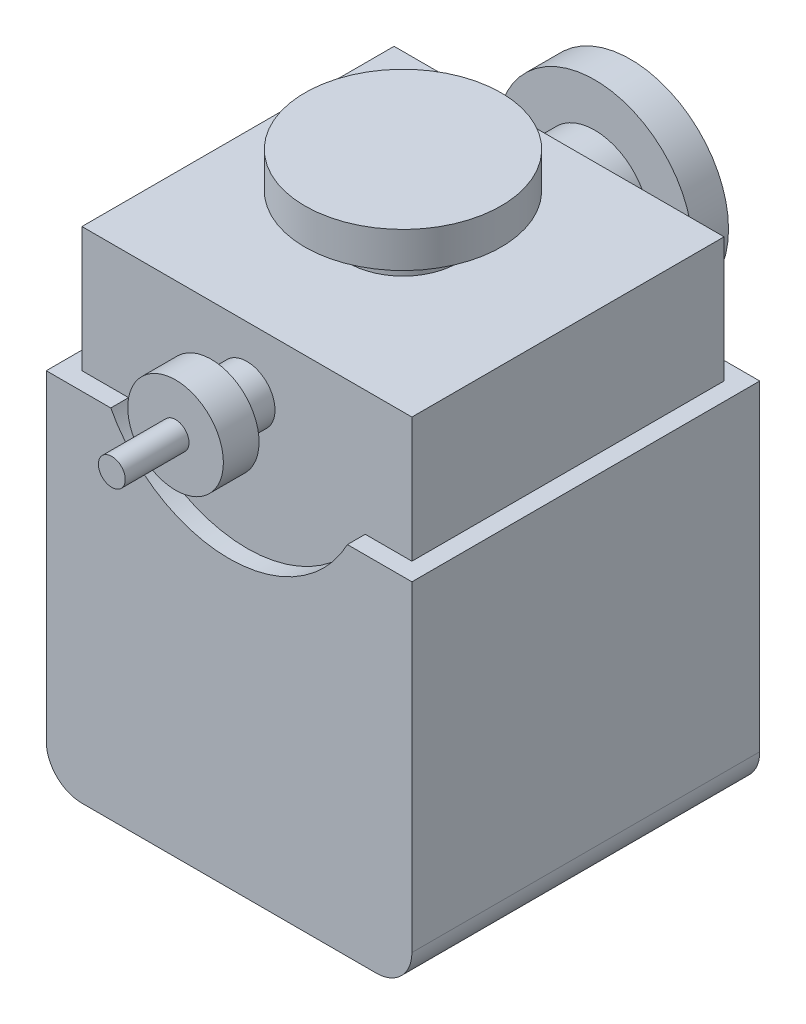
ISO-10303-21;
HEADER;
FILE_DESCRIPTION(('STEP AP214'),'2;1');
FILE_NAME('part.step','',(''),(''),'','','');
FILE_SCHEMA(('AUTOMOTIVE_DESIGN { 1 0 10303 214 1 1 1 1 }'));
ENDSEC;
DATA;
#1=APPLICATION_CONTEXT('core data for automotive mechanical design processes');
#2=APPLICATION_PROTOCOL_DEFINITION('international standard','automotive_design',2000,#1);
#3=PRODUCT_CONTEXT('',#1,'mechanical');
#4=PRODUCT('Part','Part','',(#3));
#5=PRODUCT_RELATED_PRODUCT_CATEGORY('part','',(#4));
#6=PRODUCT_DEFINITION_FORMATION('','',#4);
#7=PRODUCT_DEFINITION_CONTEXT('part definition',#1,'design');
#8=PRODUCT_DEFINITION('design','',#6,#7);
#9=PRODUCT_DEFINITION_SHAPE('','',#8);
#10=(LENGTH_UNIT() NAMED_UNIT(*) SI_UNIT(.MILLI.,.METRE.));
#11=(NAMED_UNIT(*) PLANE_ANGLE_UNIT() SI_UNIT($,.RADIAN.));
#12=(NAMED_UNIT(*) SI_UNIT($,.STERADIAN.) SOLID_ANGLE_UNIT());
#13=UNCERTAINTY_MEASURE_WITH_UNIT(LENGTH_MEASURE(1.E-05),#10,'distance_accuracy_value','');
#14=(GEOMETRIC_REPRESENTATION_CONTEXT(3) GLOBAL_UNCERTAINTY_ASSIGNED_CONTEXT((#13)) GLOBAL_UNIT_ASSIGNED_CONTEXT((#10,
#11,#12)) REPRESENTATION_CONTEXT('',''));
#15=CARTESIAN_POINT('',(0.,0.,0.));
#16=DIRECTION('',(0.,0.,1.));
#17=DIRECTION('',(1.,0.,0.));
#18=AXIS2_PLACEMENT_3D('',#15,#16,#17);
#19=CARTESIAN_POINT('',(0.,-57.14,0.));
#20=DIRECTION('',(0.,-1.,0.));
#21=DIRECTION('',(0.,0.,-1.));
#22=AXIS2_PLACEMENT_3D('',#19,#20,#21);
#23=PLANE('',#22);
#24=DIRECTION('',(0.,0.,-1.));
#25=VECTOR('',#24,1.);
#26=CARTESIAN_POINT('',(-42.1211348375136,-57.14,61.9125));
#27=LINE('',#26,#25);
#28=CARTESIAN_POINT('',(-42.1211348375136,-57.14,55.5625));
#29=VERTEX_POINT('',#28);
#30=CARTESIAN_POINT('',(-42.1211348375136,-57.14,61.9125));
#31=VERTEX_POINT('',#30);
#32=EDGE_CURVE('E62',#29,#31,#27,.F.);
#33=ORIENTED_EDGE('',*,*,#32,.F.);
#34=DIRECTION('',(-1.,0.,0.));
#35=VECTOR('',#34,1.);
#36=CARTESIAN_POINT('',(-58.7375,-57.14,55.5625));
#37=LINE('',#36,#35);
#38=CARTESIAN_POINT('',(-58.7375,-57.14,55.5625));
#39=VERTEX_POINT('',#38);
#40=EDGE_CURVE('E206',#29,#39,#37,.T.);
#41=ORIENTED_EDGE('',*,*,#40,.T.);
#42=DIRECTION('',(0.,0.,-1.));
#43=VECTOR('',#42,1.);
#44=CARTESIAN_POINT('',(-58.7375,-57.14,-55.5625));
#45=LINE('',#44,#43);
#46=CARTESIAN_POINT('',(-58.7375,-57.14,-55.5625));
#47=VERTEX_POINT('',#46);
#48=EDGE_CURVE('E210',#39,#47,#45,.T.);
#49=ORIENTED_EDGE('',*,*,#48,.T.);
#50=DIRECTION('',(1.,0.,0.));
#51=VECTOR('',#50,1.);
#52=CARTESIAN_POINT('',(-58.7375,-57.14,-55.5625));
#53=LINE('',#52,#51);
#54=CARTESIAN_POINT('',(-42.1211348375136,-57.14,-55.5625));
#55=VERTEX_POINT('',#54);
#56=EDGE_CURVE('E215',#47,#55,#53,.T.);
#57=ORIENTED_EDGE('',*,*,#56,.T.);
#58=DIRECTION('',(0.,0.,1.));
#59=VECTOR('',#58,1.);
#60=CARTESIAN_POINT('',(-42.1211348375136,-57.14,-61.9125));
#61=LINE('',#60,#59);
#62=CARTESIAN_POINT('',(-42.1211348375136,-57.14,-61.9125));
#63=VERTEX_POINT('',#62);
#64=EDGE_CURVE('E326',#63,#55,#61,.T.);
#65=ORIENTED_EDGE('',*,*,#64,.F.);
#66=DIRECTION('',(1.,0.,0.));
#67=VECTOR('',#66,1.);
#68=CARTESIAN_POINT('',(-65.0875,-57.14,-61.9125));
#69=LINE('',#68,#67);
#70=CARTESIAN_POINT('',(-65.0875,-57.14,-61.9125));
#71=VERTEX_POINT('',#70);
#72=EDGE_CURVE('E183',#71,#63,#69,.T.);
#73=ORIENTED_EDGE('',*,*,#72,.F.);
#74=DIRECTION('',(0.,0.,-1.));
#75=VECTOR('',#74,1.);
#76=CARTESIAN_POINT('',(-65.0875,-57.14,61.9125));
#77=LINE('',#76,#75);
#78=CARTESIAN_POINT('',(-65.0875,-57.14,61.9125));
#79=VERTEX_POINT('',#78);
#80=EDGE_CURVE('E171',#79,#71,#77,.T.);
#81=ORIENTED_EDGE('',*,*,#80,.F.);
#82=DIRECTION('',(-1.,0.,0.));
#83=VECTOR('',#82,1.);
#84=CARTESIAN_POINT('',(-65.0875,-57.14,61.9125));
#85=LINE('',#84,#83);
#86=EDGE_CURVE('E172',#31,#79,#85,.T.);
#87=ORIENTED_EDGE('',*,*,#86,.F.);
#88=EDGE_LOOP('',(#33,#41,#49,#57,#65,#73,#81,#87));
#89=FACE_BOUND('',#88,.T.);
#90=ADVANCED_FACE('F45',(#89),#23,.F.);
#91=DIRECTION('',(0.,0.,-1.));
#92=VECTOR('',#91,1.);
#93=CARTESIAN_POINT('',(42.1211348375136,-57.14,61.9125));
#94=LINE('',#93,#92);
#95=CARTESIAN_POINT('',(42.1211348375136,-57.14,61.9125));
#96=VERTEX_POINT('',#95);
#97=CARTESIAN_POINT('',(42.1211348375136,-57.14,55.5625));
#98=VERTEX_POINT('',#97);
#99=EDGE_CURVE('E148',#96,#98,#94,.T.);
#100=ORIENTED_EDGE('',*,*,#99,.F.);
#101=CARTESIAN_POINT('',(65.0875,-57.14,61.9125));
#102=VERTEX_POINT('',#101);
#103=EDGE_CURVE('E161',#102,#96,#85,.T.);
#104=ORIENTED_EDGE('',*,*,#103,.F.);
#105=DIRECTION('',(0.,0.,1.));
#106=VECTOR('',#105,1.);
#107=CARTESIAN_POINT('',(65.0875,-57.14,61.9125));
#108=LINE('',#107,#106);
#109=CARTESIAN_POINT('',(65.0875,-57.14,-61.9125));
#110=VERTEX_POINT('',#109);
#111=EDGE_CURVE('E179',#110,#102,#108,.T.);
#112=ORIENTED_EDGE('',*,*,#111,.F.);
#113=CARTESIAN_POINT('',(42.1211348375136,-57.14,-61.9125));
#114=VERTEX_POINT('',#113);
#115=EDGE_CURVE('E177',#114,#110,#69,.T.);
#116=ORIENTED_EDGE('',*,*,#115,.F.);
#117=DIRECTION('',(0.,0.,1.));
#118=VECTOR('',#117,1.);
#119=CARTESIAN_POINT('',(42.1211348375136,-57.14,-61.9125));
#120=LINE('',#119,#118);
#121=CARTESIAN_POINT('',(42.1211348375136,-57.14,-55.5625));
#122=VERTEX_POINT('',#121);
#123=EDGE_CURVE('E70',#122,#114,#120,.F.);
#124=ORIENTED_EDGE('',*,*,#123,.F.);
#125=CARTESIAN_POINT('',(58.7375,-57.14,-55.5625));
#126=VERTEX_POINT('',#125);
#127=EDGE_CURVE('E214',#122,#126,#53,.T.);
#128=ORIENTED_EDGE('',*,*,#127,.T.);
#129=DIRECTION('',(0.,0.,1.));
#130=VECTOR('',#129,1.);
#131=CARTESIAN_POINT('',(58.7375,-57.14,-55.5625));
#132=LINE('',#131,#130);
#133=CARTESIAN_POINT('',(58.7375,-57.14,55.5625));
#134=VERTEX_POINT('',#133);
#135=EDGE_CURVE('E203',#126,#134,#132,.T.);
#136=ORIENTED_EDGE('',*,*,#135,.T.);
#137=EDGE_CURVE('E164',#134,#98,#37,.T.);
#138=ORIENTED_EDGE('',*,*,#137,.T.);
#139=EDGE_LOOP('',(#100,#104,#112,#116,#124,#128,#136,#138));
#140=FACE_BOUND('',#139,.T.);
#141=ADVANCED_FACE('F159',(#140),#23,.F.);
#142=CARTESIAN_POINT('',(0.,12.69,0.));
#143=DIRECTION('',(0.,-1.,0.));
#144=DIRECTION('',(0.,0.,-1.));
#145=AXIS2_PLACEMENT_3D('',#142,#143,#144);
#146=CYLINDRICAL_SURFACE('',#145,34.9250000000001);
#147=CARTESIAN_POINT('',(0.,12.69,0.));
#148=DIRECTION('',(0.,1.,0.));
#149=DIRECTION('',(0.,0.,1.));
#150=AXIS2_PLACEMENT_3D('',#147,#148,#149);
#151=CIRCLE('',#150,34.9250000000001);
#152=CARTESIAN_POINT('',(0.,12.69,34.9250000000001));
#153=VERTEX_POINT('',#152);
#154=EDGE_CURVE('E256',#153,#153,#151,.T.);
#155=ORIENTED_EDGE('',*,*,#154,.F.);
#156=EDGE_LOOP('',(#155));
#157=FACE_BOUND('',#156,.T.);
#158=CARTESIAN_POINT('',(0.,0.,0.));
#159=DIRECTION('',(0.,1.,0.));
#160=DIRECTION('',(0.,0.,1.));
#161=AXIS2_PLACEMENT_3D('',#158,#159,#160);
#162=CIRCLE('',#161,34.9250000000001);
#163=CARTESIAN_POINT('',(0.,0.,34.9250000000001));
#164=VERTEX_POINT('',#163);
#165=EDGE_CURVE('E250',#164,#164,#162,.T.);
#166=ORIENTED_EDGE('',*,*,#165,.T.);
#167=EDGE_LOOP('',(#166));
#168=FACE_BOUND('',#167,.T.);
#169=ADVANCED_FACE('F402',(#157,#168),#146,.T.);
#170=CARTESIAN_POINT('',(0.,12.69,0.));
#171=DIRECTION('',(0.,1.,0.));
#172=DIRECTION('',(0.,0.,1.));
#173=AXIS2_PLACEMENT_3D('',#170,#171,#172);
#174=PLANE('',#173);
#175=ORIENTED_EDGE('',*,*,#154,.T.);
#176=EDGE_LOOP('',(#175));
#177=FACE_BOUND('',#176,.T.);
#178=ADVANCED_FACE('F436',(#177),#174,.T.);
#179=CARTESIAN_POINT('',(0.,0.,0.));
#180=DIRECTION('',(0.,1.,0.));
#181=DIRECTION('',(0.,0.,1.));
#182=AXIS2_PLACEMENT_3D('',#179,#180,#181);
#183=PLANE('',#182);
#184=CARTESIAN_POINT('',(0.,0.,0.));
#185=DIRECTION('',(0.,-1.,0.));
#186=DIRECTION('',(0.,0.,-1.));
#187=AXIS2_PLACEMENT_3D('',#184,#185,#186);
#188=CIRCLE('',#187,19.4);
#189=CARTESIAN_POINT('',(0.,0.,-19.4));
#190=VERTEX_POINT('',#189);
#191=EDGE_CURVE('E251',#190,#190,#188,.T.);
#192=ORIENTED_EDGE('',*,*,#191,.F.);
#193=EDGE_LOOP('',(#192));
#194=FACE_BOUND('',#193,.T.);
#195=ORIENTED_EDGE('',*,*,#165,.F.);
#196=EDGE_LOOP('',(#195));
#197=FACE_BOUND('',#196,.T.);
#198=ADVANCED_FACE('F434',(#194,#197),#183,.F.);
#199=CARTESIAN_POINT('',(0.,-12.69,0.));
#200=DIRECTION('',(0.,1.,0.));
#201=DIRECTION('',(0.,0.,1.));
#202=AXIS2_PLACEMENT_3D('',#199,#200,#201);
#203=CYLINDRICAL_SURFACE('',#202,19.4);
#204=CARTESIAN_POINT('',(0.,-12.69,0.));
#205=DIRECTION('',(0.,-1.,0.));
#206=DIRECTION('',(0.,0.,-1.));
#207=AXIS2_PLACEMENT_3D('',#204,#205,#206);
#208=CIRCLE('',#207,19.4);
#209=CARTESIAN_POINT('',(0.,-12.69,-19.4));
#210=VERTEX_POINT('',#209);
#211=EDGE_CURVE('E246',#210,#210,#208,.T.);
#212=ORIENTED_EDGE('',*,*,#211,.F.);
#213=EDGE_LOOP('',(#212));
#214=FACE_BOUND('',#213,.T.);
#215=ORIENTED_EDGE('',*,*,#191,.T.);
#216=EDGE_LOOP('',(#215));
#217=FACE_BOUND('',#216,.T.);
#218=ADVANCED_FACE('F430',(#214,#217),#203,.T.);
#219=CARTESIAN_POINT('',(58.7375,-57.14,-55.5625));
#220=DIRECTION('',(-1.,0.,0.));
#221=DIRECTION('',(0.,0.,1.));
#222=AXIS2_PLACEMENT_3D('',#219,#220,#221);
#223=PLANE('',#222);
#224=DIRECTION('',(0.,0.,1.));
#225=VECTOR('',#224,1.);
#226=CARTESIAN_POINT('',(58.7375,-12.69,-55.5625));
#227=LINE('',#226,#225);
#228=CARTESIAN_POINT('',(58.7375,-12.69,-55.5625));
#229=VERTEX_POINT('',#228);
#230=CARTESIAN_POINT('',(58.7375,-12.69,55.5625));
#231=VERTEX_POINT('',#230);
#232=EDGE_CURVE('E202',#229,#231,#227,.T.);
#233=ORIENTED_EDGE('',*,*,#232,.T.);
#234=DIRECTION('',(0.,1.,0.));
#235=VECTOR('',#234,1.);
#236=CARTESIAN_POINT('',(58.7375,-57.14,55.5625));
#237=LINE('',#236,#235);
#238=EDGE_CURVE('E242',#134,#231,#237,.T.);
#239=ORIENTED_EDGE('',*,*,#238,.F.);
#240=ORIENTED_EDGE('',*,*,#135,.F.);
#241=DIRECTION('',(0.,1.,0.));
#242=VECTOR('',#241,1.);
#243=CARTESIAN_POINT('',(58.7375,-57.14,-55.5625));
#244=LINE('',#243,#242);
#245=EDGE_CURVE('E219',#126,#229,#244,.T.);
#246=ORIENTED_EDGE('',*,*,#245,.T.);
#247=EDGE_LOOP('',(#233,#239,#240,#246));
#248=FACE_BOUND('',#247,.T.);
#249=ADVANCED_FACE('F303',(#248),#223,.F.);
#250=CARTESIAN_POINT('',(-58.7375,-57.14,55.5625));
#251=DIRECTION('',(0.,0.,-1.));
#252=DIRECTION('',(-1.,0.,0.));
#253=AXIS2_PLACEMENT_3D('',#250,#251,#252);
#254=PLANE('',#253);
#255=CARTESIAN_POINT('',(0.,-34.915,55.5625));
#256=DIRECTION('',(0.,0.,-1.));
#257=DIRECTION('',(-1.,0.,0.));
#258=AXIS2_PLACEMENT_3D('',#255,#256,#257);
#259=CIRCLE('',#258,10.);
#260=CARTESIAN_POINT('',(-10.,-34.915,55.5625));
#261=VERTEX_POINT('',#260);
#262=EDGE_CURVE('E49',#261,#261,#259,.F.);
#263=ORIENTED_EDGE('',*,*,#262,.F.);
#264=EDGE_LOOP('',(#263));
#265=FACE_BOUND('',#264,.T.);
#266=ORIENTED_EDGE('',*,*,#40,.F.);
#267=CARTESIAN_POINT('',(0.,-34.915,55.5625));
#268=DIRECTION('',(0.,0.,1.));
#269=DIRECTION('',(1.,0.,0.));
#270=AXIS2_PLACEMENT_3D('',#267,#268,#269);
#271=CIRCLE('',#270,47.625);
#272=EDGE_CURVE('E154',#29,#98,#271,.T.);
#273=ORIENTED_EDGE('',*,*,#272,.T.);
#274=ORIENTED_EDGE('',*,*,#137,.F.);
#275=ORIENTED_EDGE('',*,*,#238,.T.);
#276=DIRECTION('',(-1.,0.,0.));
#277=VECTOR('',#276,1.);
#278=CARTESIAN_POINT('',(-58.7375,-12.69,55.5625));
#279=LINE('',#278,#277);
#280=CARTESIAN_POINT('',(-58.7375,-12.69,55.5625));
#281=VERTEX_POINT('',#280);
#282=EDGE_CURVE('E223',#231,#281,#279,.T.);
#283=ORIENTED_EDGE('',*,*,#282,.T.);
#284=DIRECTION('',(0.,1.,0.));
#285=VECTOR('',#284,1.);
#286=CARTESIAN_POINT('',(-58.7375,-57.14,55.5625));
#287=LINE('',#286,#285);
#288=EDGE_CURVE('E238',#39,#281,#287,.T.);
#289=ORIENTED_EDGE('',*,*,#288,.F.);
#290=EDGE_LOOP('',(#266,#273,#274,#275,#283,#289));
#291=FACE_BOUND('',#290,.T.);
#292=ADVANCED_FACE('F299',(#265,#291),#254,.F.);
#293=CARTESIAN_POINT('',(-58.7375,-57.14,-55.5625));
#294=DIRECTION('',(1.,0.,0.));
#295=DIRECTION('',(0.,0.,-1.));
#296=AXIS2_PLACEMENT_3D('',#293,#294,#295);
#297=PLANE('',#296);
#298=DIRECTION('',(0.,0.,-1.));
#299=VECTOR('',#298,1.);
#300=CARTESIAN_POINT('',(-58.7375,-12.69,-55.5625));
#301=LINE('',#300,#299);
#302=CARTESIAN_POINT('',(-58.7375,-12.69,-55.5625));
#303=VERTEX_POINT('',#302);
#304=EDGE_CURVE('E226',#281,#303,#301,.T.);
#305=ORIENTED_EDGE('',*,*,#304,.T.);
#306=DIRECTION('',(0.,1.,0.));
#307=VECTOR('',#306,1.);
#308=CARTESIAN_POINT('',(-58.7375,-57.14,-55.5625));
#309=LINE('',#308,#307);
#310=EDGE_CURVE('E234',#47,#303,#309,.T.);
#311=ORIENTED_EDGE('',*,*,#310,.F.);
#312=ORIENTED_EDGE('',*,*,#48,.F.);
#313=ORIENTED_EDGE('',*,*,#288,.T.);
#314=EDGE_LOOP('',(#305,#311,#312,#313));
#315=FACE_BOUND('',#314,.T.);
#316=ADVANCED_FACE('F302',(#315),#297,.F.);
#317=CARTESIAN_POINT('',(-58.7375,-57.14,-55.5625));
#318=DIRECTION('',(0.,0.,1.));
#319=DIRECTION('',(1.,0.,0.));
#320=AXIS2_PLACEMENT_3D('',#317,#318,#319);
#321=PLANE('',#320);
#322=CARTESIAN_POINT('',(0.,-34.915,-55.5625));
#323=DIRECTION('',(0.,0.,1.));
#324=DIRECTION('',(1.,0.,0.));
#325=AXIS2_PLACEMENT_3D('',#322,#323,#324);
#326=CIRCLE('',#325,19.4);
#327=CARTESIAN_POINT('',(19.4,-34.915,-55.5625));
#328=VERTEX_POINT('',#327);
#329=EDGE_CURVE('E288',#328,#328,#326,.F.);
#330=ORIENTED_EDGE('',*,*,#329,.F.);
#331=EDGE_LOOP('',(#330));
#332=FACE_BOUND('',#331,.T.);
#333=ORIENTED_EDGE('',*,*,#127,.F.);
#334=CARTESIAN_POINT('',(0.,-34.915,-55.5625));
#335=DIRECTION('',(0.,0.,-1.));
#336=DIRECTION('',(-1.,0.,0.));
#337=AXIS2_PLACEMENT_3D('',#334,#335,#336);
#338=CIRCLE('',#337,47.625);
#339=EDGE_CURVE('E331',#122,#55,#338,.T.);
#340=ORIENTED_EDGE('',*,*,#339,.T.);
#341=ORIENTED_EDGE('',*,*,#56,.F.);
#342=ORIENTED_EDGE('',*,*,#310,.T.);
#343=DIRECTION('',(1.,0.,0.));
#344=VECTOR('',#343,1.);
#345=CARTESIAN_POINT('',(-58.7375,-12.69,-55.5625));
#346=LINE('',#345,#344);
#347=EDGE_CURVE('E207',#303,#229,#346,.T.);
#348=ORIENTED_EDGE('',*,*,#347,.T.);
#349=ORIENTED_EDGE('',*,*,#245,.F.);
#350=EDGE_LOOP('',(#333,#340,#341,#342,#348,#349));
#351=FACE_BOUND('',#350,.T.);
#352=ADVANCED_FACE('F420',(#332,#351),#321,.F.);
#353=CARTESIAN_POINT('',(0.,-12.69,0.));
#354=DIRECTION('',(0.,1.,0.));
#355=DIRECTION('',(0.,0.,1.));
#356=AXIS2_PLACEMENT_3D('',#353,#354,#355);
#357=PLANE('',#356);
#358=ORIENTED_EDGE('',*,*,#211,.T.);
#359=EDGE_LOOP('',(#358));
#360=FACE_BOUND('',#359,.T.);
#361=ORIENTED_EDGE('',*,*,#232,.F.);
#362=ORIENTED_EDGE('',*,*,#347,.F.);
#363=ORIENTED_EDGE('',*,*,#304,.F.);
#364=ORIENTED_EDGE('',*,*,#282,.F.);
#365=EDGE_LOOP('',(#361,#362,#363,#364));
#366=FACE_BOUND('',#365,.T.);
#367=ADVANCED_FACE('F417',(#360,#366),#357,.T.);
#368=CARTESIAN_POINT('',(65.0875,-184.14,61.9125));
#369=DIRECTION('',(-1.,0.,0.));
#370=DIRECTION('',(0.,0.,1.));
#371=AXIS2_PLACEMENT_3D('',#368,#369,#370);
#372=PLANE('',#371);
#373=DIRECTION('',(0.,1.,0.));
#374=VECTOR('',#373,1.);
#375=CARTESIAN_POINT('',(65.0875,-184.14,61.9125));
#376=LINE('',#375,#374);
#377=CARTESIAN_POINT('',(65.0875,-171.44,61.9125));
#378=VERTEX_POINT('',#377);
#379=EDGE_CURVE('E169',#378,#102,#376,.T.);
#380=ORIENTED_EDGE('',*,*,#379,.F.);
#381=DIRECTION('',(0.,0.,1.));
#382=VECTOR('',#381,1.);
#383=CARTESIAN_POINT('',(65.0875,-171.44,-61.9125));
#384=LINE('',#383,#382);
#385=CARTESIAN_POINT('',(65.0875,-171.44,-61.9125));
#386=VERTEX_POINT('',#385);
#387=EDGE_CURVE('E269',#378,#386,#384,.F.);
#388=ORIENTED_EDGE('',*,*,#387,.T.);
#389=DIRECTION('',(0.,1.,0.));
#390=VECTOR('',#389,1.);
#391=CARTESIAN_POINT('',(65.0875,-184.14,-61.9125));
#392=LINE('',#391,#390);
#393=EDGE_CURVE('E188',#386,#110,#392,.T.);
#394=ORIENTED_EDGE('',*,*,#393,.T.);
#395=ORIENTED_EDGE('',*,*,#111,.T.);
#396=EDGE_LOOP('',(#380,#388,#394,#395));
#397=FACE_BOUND('',#396,.T.);
#398=ADVANCED_FACE('F322',(#397),#372,.F.);
#399=CARTESIAN_POINT('',(-65.0875,-184.14,61.9125));
#400=DIRECTION('',(0.,0.,-1.));
#401=DIRECTION('',(-1.,0.,0.));
#402=AXIS2_PLACEMENT_3D('',#399,#400,#401);
#403=PLANE('',#402);
#404=CARTESIAN_POINT('',(0.,-34.915,61.9125));
#405=DIRECTION('',(0.,0.,1.));
#406=DIRECTION('',(1.,0.,0.));
#407=AXIS2_PLACEMENT_3D('',#404,#405,#406);
#408=CIRCLE('',#407,47.625);
#409=EDGE_CURVE('E145',#31,#96,#408,.T.);
#410=ORIENTED_EDGE('',*,*,#409,.F.);
#411=ORIENTED_EDGE('',*,*,#86,.T.);
#412=DIRECTION('',(0.,1.,0.));
#413=VECTOR('',#412,1.);
#414=CARTESIAN_POINT('',(-65.0875,-184.14,61.9125));
#415=LINE('',#414,#413);
#416=CARTESIAN_POINT('',(-65.0875,-171.44,61.9125));
#417=VERTEX_POINT('',#416);
#418=EDGE_CURVE('E196',#417,#79,#415,.T.);
#419=ORIENTED_EDGE('',*,*,#418,.F.);
#420=CARTESIAN_POINT('',(-52.3875,-171.44,61.9125));
#421=DIRECTION('',(0.,0.,-1.));
#422=DIRECTION('',(-1.,0.,0.));
#423=AXIS2_PLACEMENT_3D('',#420,#421,#422);
#424=CIRCLE('',#423,12.7);
#425=CARTESIAN_POINT('',(-52.3875,-184.14,61.9125));
#426=VERTEX_POINT('',#425);
#427=EDGE_CURVE('E286',#417,#426,#424,.F.);
#428=ORIENTED_EDGE('',*,*,#427,.T.);
#429=DIRECTION('',(-1.,0.,0.));
#430=VECTOR('',#429,1.);
#431=CARTESIAN_POINT('',(-65.0875,-184.14,61.9125));
#432=LINE('',#431,#430);
#433=CARTESIAN_POINT('',(52.3875,-184.14,61.9125));
#434=VERTEX_POINT('',#433);
#435=EDGE_CURVE('E187',#434,#426,#432,.T.);
#436=ORIENTED_EDGE('',*,*,#435,.F.);
#437=CARTESIAN_POINT('',(52.3875,-171.44,61.9125));
#438=DIRECTION('',(0.,0.,-1.));
#439=DIRECTION('',(-1.,0.,0.));
#440=AXIS2_PLACEMENT_3D('',#437,#438,#439);
#441=CIRCLE('',#440,12.7);
#442=EDGE_CURVE('E266',#434,#378,#441,.F.);
#443=ORIENTED_EDGE('',*,*,#442,.T.);
#444=ORIENTED_EDGE('',*,*,#379,.T.);
#445=ORIENTED_EDGE('',*,*,#103,.T.);
#446=EDGE_LOOP('',(#410,#411,#419,#428,#436,#443,#444,#445));
#447=FACE_BOUND('',#446,.T.);
#448=ADVANCED_FACE('F167',(#447),#403,.F.);
#449=CARTESIAN_POINT('',(-65.0875,-184.14,61.9125));
#450=DIRECTION('',(1.,0.,0.));
#451=DIRECTION('',(0.,0.,-1.));
#452=AXIS2_PLACEMENT_3D('',#449,#450,#451);
#453=PLANE('',#452);
#454=DIRECTION('',(0.,1.,0.));
#455=VECTOR('',#454,1.);
#456=CARTESIAN_POINT('',(-65.0875,-184.14,-61.9125));
#457=LINE('',#456,#455);
#458=CARTESIAN_POINT('',(-65.0875,-171.44,-61.9125));
#459=VERTEX_POINT('',#458);
#460=EDGE_CURVE('E192',#459,#71,#457,.T.);
#461=ORIENTED_EDGE('',*,*,#460,.F.);
#462=DIRECTION('',(0.,0.,-1.));
#463=VECTOR('',#462,1.);
#464=CARTESIAN_POINT('',(-65.0875,-171.44,61.9125));
#465=LINE('',#464,#463);
#466=EDGE_CURVE('E283',#459,#417,#465,.F.);
#467=ORIENTED_EDGE('',*,*,#466,.T.);
#468=ORIENTED_EDGE('',*,*,#418,.T.);
#469=ORIENTED_EDGE('',*,*,#80,.T.);
#470=EDGE_LOOP('',(#461,#467,#468,#469));
#471=FACE_BOUND('',#470,.T.);
#472=ADVANCED_FACE('F409',(#471),#453,.F.);
#473=CARTESIAN_POINT('',(-65.0875,-184.14,-61.9125));
#474=DIRECTION('',(0.,0.,1.));
#475=DIRECTION('',(1.,0.,0.));
#476=AXIS2_PLACEMENT_3D('',#473,#474,#475);
#477=PLANE('',#476);
#478=CARTESIAN_POINT('',(0.,-34.915,-61.9125));
#479=DIRECTION('',(0.,0.,-1.));
#480=DIRECTION('',(-1.,0.,0.));
#481=AXIS2_PLACEMENT_3D('',#478,#479,#480);
#482=CIRCLE('',#481,47.625);
#483=EDGE_CURVE('E320',#114,#63,#482,.T.);
#484=ORIENTED_EDGE('',*,*,#483,.F.);
#485=ORIENTED_EDGE('',*,*,#115,.T.);
#486=ORIENTED_EDGE('',*,*,#393,.F.);
#487=CARTESIAN_POINT('',(52.3875,-171.44,-61.9125));
#488=DIRECTION('',(0.,0.,1.));
#489=DIRECTION('',(1.,0.,0.));
#490=AXIS2_PLACEMENT_3D('',#487,#488,#489);
#491=CIRCLE('',#490,12.7);
#492=CARTESIAN_POINT('',(52.3875,-184.14,-61.9125));
#493=VERTEX_POINT('',#492);
#494=EDGE_CURVE('E272',#386,#493,#491,.F.);
#495=ORIENTED_EDGE('',*,*,#494,.T.);
#496=DIRECTION('',(1.,0.,0.));
#497=VECTOR('',#496,1.);
#498=CARTESIAN_POINT('',(-65.0875,-184.14,-61.9125));
#499=LINE('',#498,#497);
#500=CARTESIAN_POINT('',(-52.3875,-184.14,-61.9125));
#501=VERTEX_POINT('',#500);
#502=EDGE_CURVE('E193',#501,#493,#499,.T.);
#503=ORIENTED_EDGE('',*,*,#502,.F.);
#504=CARTESIAN_POINT('',(-52.3875,-171.44,-61.9125));
#505=DIRECTION('',(0.,0.,1.));
#506=DIRECTION('',(1.,0.,0.));
#507=AXIS2_PLACEMENT_3D('',#504,#505,#506);
#508=CIRCLE('',#507,12.7);
#509=EDGE_CURVE('E280',#501,#459,#508,.F.);
#510=ORIENTED_EDGE('',*,*,#509,.T.);
#511=ORIENTED_EDGE('',*,*,#460,.T.);
#512=ORIENTED_EDGE('',*,*,#72,.T.);
#513=EDGE_LOOP('',(#484,#485,#486,#495,#503,#510,#511,#512));
#514=FACE_BOUND('',#513,.T.);
#515=ADVANCED_FACE('F318',(#514),#477,.F.);
#516=CARTESIAN_POINT('',(0.,-184.14,0.));
#517=DIRECTION('',(0.,-1.,0.));
#518=DIRECTION('',(0.,0.,-1.));
#519=AXIS2_PLACEMENT_3D('',#516,#517,#518);
#520=PLANE('',#519);
#521=ORIENTED_EDGE('',*,*,#435,.T.);
#522=DIRECTION('',(0.,0.,-1.));
#523=VECTOR('',#522,1.);
#524=CARTESIAN_POINT('',(-52.3875,-184.14,-61.9125));
#525=LINE('',#524,#523);
#526=EDGE_CURVE('E276',#426,#501,#525,.T.);
#527=ORIENTED_EDGE('',*,*,#526,.T.);
#528=ORIENTED_EDGE('',*,*,#502,.T.);
#529=DIRECTION('',(0.,0.,1.));
#530=VECTOR('',#529,1.);
#531=CARTESIAN_POINT('',(52.3875,-184.14,61.9125));
#532=LINE('',#531,#530);
#533=EDGE_CURVE('E255',#493,#434,#532,.T.);
#534=ORIENTED_EDGE('',*,*,#533,.T.);
#535=EDGE_LOOP('',(#521,#527,#528,#534));
#536=FACE_BOUND('',#535,.T.);
#537=ADVANCED_FACE('F405',(#536),#520,.T.);
#538=CARTESIAN_POINT('',(52.3875,-171.44,0.));
#539=DIRECTION('',(0.,0.,-1.));
#540=DIRECTION('',(-1.,0.,0.));
#541=AXIS2_PLACEMENT_3D('',#538,#539,#540);
#542=CYLINDRICAL_SURFACE('',#541,12.7);
#543=ORIENTED_EDGE('',*,*,#494,.F.);
#544=ORIENTED_EDGE('',*,*,#387,.F.);
#545=ORIENTED_EDGE('',*,*,#442,.F.);
#546=ORIENTED_EDGE('',*,*,#533,.F.);
#547=EDGE_LOOP('',(#543,#544,#545,#546));
#548=FACE_BOUND('',#547,.T.);
#549=ADVANCED_FACE('F445',(#548),#542,.T.);
#550=CARTESIAN_POINT('',(-52.3875,-171.44,0.));
#551=DIRECTION('',(0.,0.,1.));
#552=DIRECTION('',(1.,0.,0.));
#553=AXIS2_PLACEMENT_3D('',#550,#551,#552);
#554=CYLINDRICAL_SURFACE('',#553,12.7);
#555=ORIENTED_EDGE('',*,*,#427,.F.);
#556=ORIENTED_EDGE('',*,*,#466,.F.);
#557=ORIENTED_EDGE('',*,*,#509,.F.);
#558=ORIENTED_EDGE('',*,*,#526,.F.);
#559=EDGE_LOOP('',(#555,#556,#557,#558));
#560=FACE_BOUND('',#559,.T.);
#561=ADVANCED_FACE('F47',(#560),#554,.T.);
#562=CARTESIAN_POINT('',(0.,-34.915,-61.9125));
#563=DIRECTION('',(0.,0.,1.));
#564=DIRECTION('',(1.,0.,0.));
#565=AXIS2_PLACEMENT_3D('',#562,#563,#564);
#566=CYLINDRICAL_SURFACE('',#565,47.625);
#567=ORIENTED_EDGE('',*,*,#123,.T.);
#568=ORIENTED_EDGE('',*,*,#483,.T.);
#569=ORIENTED_EDGE('',*,*,#64,.T.);
#570=ORIENTED_EDGE('',*,*,#339,.F.);
#571=EDGE_LOOP('',(#567,#568,#569,#570));
#572=FACE_BOUND('',#571,.T.);
#573=ADVANCED_FACE('F451',(#572),#566,.F.);
#574=CARTESIAN_POINT('',(0.,-34.915,-68.2625));
#575=DIRECTION('',(0.,0.,1.));
#576=DIRECTION('',(1.,0.,0.));
#577=AXIS2_PLACEMENT_3D('',#574,#575,#576);
#578=CYLINDRICAL_SURFACE('',#577,19.4);
#579=CARTESIAN_POINT('',(0.,-34.915,-68.2625));
#580=DIRECTION('',(0.,0.,-1.));
#581=DIRECTION('',(-1.,0.,0.));
#582=AXIS2_PLACEMENT_3D('',#579,#580,#581);
#583=CIRCLE('',#582,19.4);
#584=CARTESIAN_POINT('',(-19.4,-34.915,-68.2625));
#585=VERTEX_POINT('',#584);
#586=EDGE_CURVE('E335',#585,#585,#583,.T.);
#587=ORIENTED_EDGE('',*,*,#586,.F.);
#588=EDGE_LOOP('',(#587));
#589=FACE_BOUND('',#588,.T.);
#590=ORIENTED_EDGE('',*,*,#329,.T.);
#591=EDGE_LOOP('',(#590));
#592=FACE_BOUND('',#591,.T.);
#593=ADVANCED_FACE('F478',(#589,#592),#578,.T.);
#594=CARTESIAN_POINT('',(0.,-34.915,-80.9625));
#595=DIRECTION('',(0.,0.,1.));
#596=DIRECTION('',(1.,0.,0.));
#597=AXIS2_PLACEMENT_3D('',#594,#595,#596);
#598=CYLINDRICAL_SURFACE('',#597,34.925);
#599=CARTESIAN_POINT('',(0.,-34.915,-80.9625));
#600=DIRECTION('',(0.,0.,-1.));
#601=DIRECTION('',(-1.,0.,0.));
#602=AXIS2_PLACEMENT_3D('',#599,#600,#601);
#603=CIRCLE('',#602,34.925);
#604=CARTESIAN_POINT('',(-34.925,-34.915,-80.9625));
#605=VERTEX_POINT('',#604);
#606=EDGE_CURVE('E341',#605,#605,#603,.T.);
#607=ORIENTED_EDGE('',*,*,#606,.F.);
#608=EDGE_LOOP('',(#607));
#609=FACE_BOUND('',#608,.T.);
#610=CARTESIAN_POINT('',(0.,-34.915,-68.2625));
#611=DIRECTION('',(0.,0.,-1.));
#612=DIRECTION('',(-1.,0.,0.));
#613=AXIS2_PLACEMENT_3D('',#610,#611,#612);
#614=CIRCLE('',#613,34.925);
#615=CARTESIAN_POINT('',(-34.925,-34.915,-68.2625));
#616=VERTEX_POINT('',#615);
#617=EDGE_CURVE('E342',#616,#616,#614,.T.);
#618=ORIENTED_EDGE('',*,*,#617,.T.);
#619=EDGE_LOOP('',(#618));
#620=FACE_BOUND('',#619,.T.);
#621=ADVANCED_FACE('F482',(#609,#620),#598,.T.);
#622=CARTESIAN_POINT('',(0.,-34.915,-80.9625));
#623=DIRECTION('',(0.,0.,-1.));
#624=DIRECTION('',(-1.,0.,0.));
#625=AXIS2_PLACEMENT_3D('',#622,#623,#624);
#626=PLANE('',#625);
#627=ORIENTED_EDGE('',*,*,#606,.T.);
#628=EDGE_LOOP('',(#627));
#629=FACE_BOUND('',#628,.T.);
#630=ADVANCED_FACE('F488',(#629),#626,.T.);
#631=CARTESIAN_POINT('',(0.,-34.915,-68.2625));
#632=DIRECTION('',(0.,0.,-1.));
#633=DIRECTION('',(-1.,0.,0.));
#634=AXIS2_PLACEMENT_3D('',#631,#632,#633);
#635=PLANE('',#634);
#636=ORIENTED_EDGE('',*,*,#586,.T.);
#637=EDGE_LOOP('',(#636));
#638=FACE_BOUND('',#637,.T.);
#639=ORIENTED_EDGE('',*,*,#617,.F.);
#640=EDGE_LOOP('',(#639));
#641=FACE_BOUND('',#640,.T.);
#642=ADVANCED_FACE('F490',(#638,#641),#635,.F.);
#643=CARTESIAN_POINT('',(0.,-34.915,61.9125));
#644=DIRECTION('',(0.,0.,-1.));
#645=DIRECTION('',(-1.,0.,0.));
#646=AXIS2_PLACEMENT_3D('',#643,#644,#645);
#647=CYLINDRICAL_SURFACE('',#646,47.625);
#648=ORIENTED_EDGE('',*,*,#32,.T.);
#649=ORIENTED_EDGE('',*,*,#409,.T.);
#650=ORIENTED_EDGE('',*,*,#99,.T.);
#651=ORIENTED_EDGE('',*,*,#272,.F.);
#652=EDGE_LOOP('',(#648,#649,#650,#651));
#653=FACE_BOUND('',#652,.T.);
#654=ADVANCED_FACE('F147',(#653),#647,.F.);
#655=CARTESIAN_POINT('',(0.,-34.915,68.2625));
#656=DIRECTION('',(0.,0.,-1.));
#657=DIRECTION('',(-1.,0.,0.));
#658=AXIS2_PLACEMENT_3D('',#655,#656,#657);
#659=CYLINDRICAL_SURFACE('',#658,10.);
#660=CARTESIAN_POINT('',(0.,-34.915,68.2625));
#661=DIRECTION('',(0.,0.,1.));
#662=DIRECTION('',(1.,0.,0.));
#663=AXIS2_PLACEMENT_3D('',#660,#661,#662);
#664=CIRCLE('',#663,10.);
#665=CARTESIAN_POINT('',(9.99999999999999,-34.915,68.2625));
#666=VERTEX_POINT('',#665);
#667=EDGE_CURVE('E352',#666,#666,#664,.T.);
#668=ORIENTED_EDGE('',*,*,#667,.F.);
#669=EDGE_LOOP('',(#668));
#670=FACE_BOUND('',#669,.T.);
#671=ORIENTED_EDGE('',*,*,#262,.T.);
#672=EDGE_LOOP('',(#671));
#673=FACE_BOUND('',#672,.T.);
#674=ADVANCED_FACE('F297',(#670,#673),#659,.T.);
#675=CARTESIAN_POINT('',(0.,-34.915,80.9625));
#676=DIRECTION('',(0.,0.,-1.));
#677=DIRECTION('',(-1.,0.,0.));
#678=AXIS2_PLACEMENT_3D('',#675,#676,#677);
#679=CYLINDRICAL_SURFACE('',#678,17.018);
#680=CARTESIAN_POINT('',(0.,-34.915,80.9625));
#681=DIRECTION('',(0.,0.,1.));
#682=DIRECTION('',(1.,0.,0.));
#683=AXIS2_PLACEMENT_3D('',#680,#681,#682);
#684=CIRCLE('',#683,17.018);
#685=CARTESIAN_POINT('',(17.018,-34.915,80.9625));
#686=VERTEX_POINT('',#685);
#687=EDGE_CURVE('E357',#686,#686,#684,.T.);
#688=ORIENTED_EDGE('',*,*,#687,.F.);
#689=EDGE_LOOP('',(#688));
#690=FACE_BOUND('',#689,.T.);
#691=CARTESIAN_POINT('',(0.,-34.915,68.2625));
#692=DIRECTION('',(0.,0.,1.));
#693=DIRECTION('',(1.,0.,0.));
#694=AXIS2_PLACEMENT_3D('',#691,#692,#693);
#695=CIRCLE('',#694,17.018);
#696=CARTESIAN_POINT('',(17.018,-34.915,68.2625));
#697=VERTEX_POINT('',#696);
#698=EDGE_CURVE('E358',#697,#697,#695,.T.);
#699=ORIENTED_EDGE('',*,*,#698,.T.);
#700=EDGE_LOOP('',(#699));
#701=FACE_BOUND('',#700,.T.);
#702=ADVANCED_FACE('F382',(#690,#701),#679,.T.);
#703=CARTESIAN_POINT('',(0.,-34.915,80.9625));
#704=DIRECTION('',(0.,0.,1.));
#705=DIRECTION('',(1.,0.,0.));
#706=AXIS2_PLACEMENT_3D('',#703,#704,#705);
#707=PLANE('',#706);
#708=CARTESIAN_POINT('',(0.,-34.915,80.9625));
#709=DIRECTION('',(0.,0.,1.));
#710=DIRECTION('',(1.,0.,0.));
#711=AXIS2_PLACEMENT_3D('',#708,#709,#710);
#712=CIRCLE('',#711,4.78559077771676);
#713=CARTESIAN_POINT('',(4.78559077771675,-34.915,80.9625));
#714=VERTEX_POINT('',#713);
#715=EDGE_CURVE('E11',#714,#714,#712,.T.);
#716=ORIENTED_EDGE('',*,*,#715,.F.);
#717=EDGE_LOOP('',(#716));
#718=FACE_BOUND('',#717,.T.);
#719=ORIENTED_EDGE('',*,*,#687,.T.);
#720=EDGE_LOOP('',(#719));
#721=FACE_BOUND('',#720,.T.);
#722=ADVANCED_FACE('F379',(#718,#721),#707,.T.);
#723=CARTESIAN_POINT('',(0.,-34.915,68.2625));
#724=DIRECTION('',(0.,0.,1.));
#725=DIRECTION('',(1.,0.,0.));
#726=AXIS2_PLACEMENT_3D('',#723,#724,#725);
#727=PLANE('',#726);
#728=ORIENTED_EDGE('',*,*,#667,.T.);
#729=EDGE_LOOP('',(#728));
#730=FACE_BOUND('',#729,.T.);
#731=ORIENTED_EDGE('',*,*,#698,.F.);
#732=EDGE_LOOP('',(#731));
#733=FACE_BOUND('',#732,.T.);
#734=ADVANCED_FACE('F375',(#730,#733),#727,.F.);
#735=CARTESIAN_POINT('',(0.,-34.915,103.6625));
#736=DIRECTION('',(0.,0.,-1.));
#737=DIRECTION('',(-1.,0.,0.));
#738=AXIS2_PLACEMENT_3D('',#735,#736,#737);
#739=CYLINDRICAL_SURFACE('',#738,4.78559077771676);
#740=CARTESIAN_POINT('',(0.,-34.915,103.6625));
#741=DIRECTION('',(0.,0.,1.));
#742=DIRECTION('',(1.,0.,0.));
#743=AXIS2_PLACEMENT_3D('',#740,#741,#742);
#744=CIRCLE('',#743,4.78559077771676);
#745=CARTESIAN_POINT('',(4.78559077771675,-34.915,103.6625));
#746=VERTEX_POINT('',#745);
#747=EDGE_CURVE('E362',#746,#746,#744,.T.);
#748=ORIENTED_EDGE('',*,*,#747,.F.);
#749=EDGE_LOOP('',(#748));
#750=FACE_BOUND('',#749,.T.);
#751=ORIENTED_EDGE('',*,*,#715,.T.);
#752=EDGE_LOOP('',(#751));
#753=FACE_BOUND('',#752,.T.);
#754=ADVANCED_FACE('F372',(#750,#753),#739,.T.);
#755=CARTESIAN_POINT('',(0.,-34.915,103.6625));
#756=DIRECTION('',(0.,0.,1.));
#757=DIRECTION('',(1.,0.,0.));
#758=AXIS2_PLACEMENT_3D('',#755,#756,#757);
#759=PLANE('',#758);
#760=ORIENTED_EDGE('',*,*,#747,.T.);
#761=EDGE_LOOP('',(#760));
#762=FACE_BOUND('',#761,.T.);
#763=ADVANCED_FACE('F370',(#762),#759,.T.);
#764=CLOSED_SHELL('',(#90,#141,#169,#178,#198,#218,#249,#292,#316,#352,#367,#398,#448,#472,#515,
#537,#549,#561,#573,#593,#621,#630,#642,#654,#674,#702,#722,#734,#754,#763));
#765=MANIFOLD_SOLID_BREP('B2',#764);
#766=ADVANCED_BREP_SHAPE_REPRESENTATION('',(#18,#765),#14);
#767=SHAPE_DEFINITION_REPRESENTATION(#9,#766);
ENDSEC;
END-ISO-10303-21;
